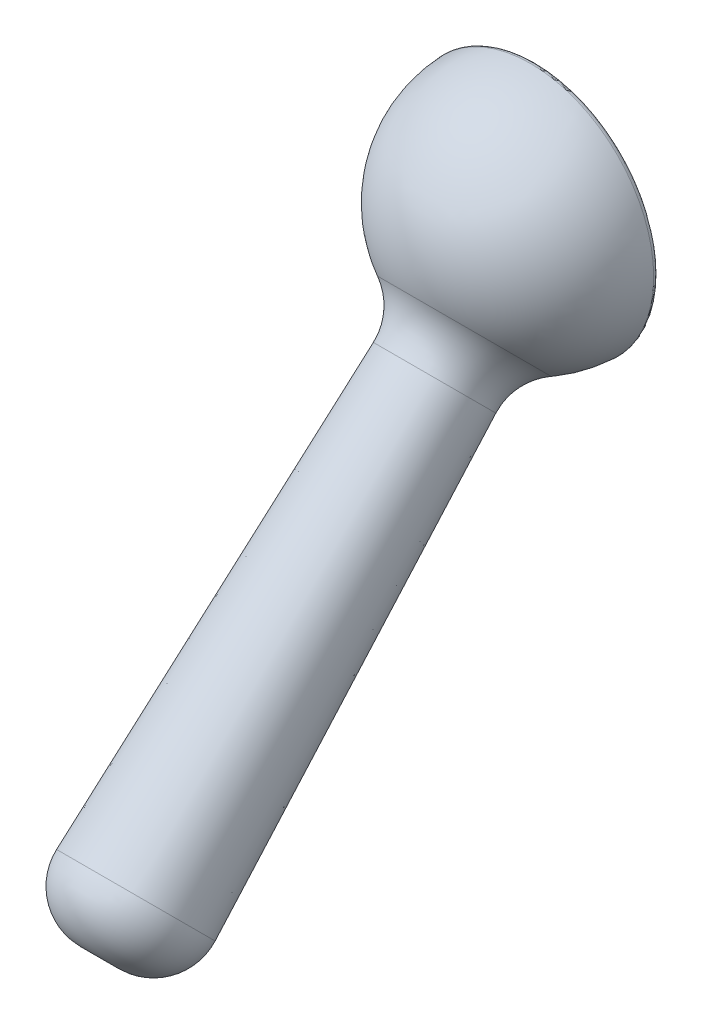
ISO-10303-21;
HEADER;
FILE_DESCRIPTION(('STEP AP214'),'2;1');
FILE_NAME('part.step','',(''),(''),'','','');
FILE_SCHEMA(('AUTOMOTIVE_DESIGN { 1 0 10303 214 1 1 1 1 }'));
ENDSEC;
DATA;
#1=APPLICATION_CONTEXT('core data for automotive mechanical design processes');
#2=APPLICATION_PROTOCOL_DEFINITION('international standard','automotive_design',2000,#1);
#3=PRODUCT_CONTEXT('',#1,'mechanical');
#4=PRODUCT('Part','Part','',(#3));
#5=PRODUCT_RELATED_PRODUCT_CATEGORY('part','',(#4));
#6=PRODUCT_DEFINITION_FORMATION('','',#4);
#7=PRODUCT_DEFINITION_CONTEXT('part definition',#1,'design');
#8=PRODUCT_DEFINITION('design','',#6,#7);
#9=PRODUCT_DEFINITION_SHAPE('','',#8);
#10=(LENGTH_UNIT() NAMED_UNIT(*) SI_UNIT(.MILLI.,.METRE.));
#11=(NAMED_UNIT(*) PLANE_ANGLE_UNIT() SI_UNIT($,.RADIAN.));
#12=(NAMED_UNIT(*) SI_UNIT($,.STERADIAN.) SOLID_ANGLE_UNIT());
#13=UNCERTAINTY_MEASURE_WITH_UNIT(LENGTH_MEASURE(1.E-05),#10,'distance_accuracy_value','');
#14=(GEOMETRIC_REPRESENTATION_CONTEXT(3) GLOBAL_UNCERTAINTY_ASSIGNED_CONTEXT((#13)) GLOBAL_UNIT_ASSIGNED_CONTEXT((#10,
#11,#12)) REPRESENTATION_CONTEXT('',''));
#15=CARTESIAN_POINT('',(0.,0.,0.));
#16=DIRECTION('',(0.,0.,1.));
#17=DIRECTION('',(1.,0.,0.));
#18=AXIS2_PLACEMENT_3D('',#15,#16,#17);
#19=CARTESIAN_POINT('',(0.,0.,0.));
#20=DIRECTION('',(0.,0.,1.));
#21=DIRECTION('',(0.,1.,0.));
#22=AXIS2_PLACEMENT_3D('',#19,#20,#21);
#23=SPHERICAL_SURFACE('',#22,25.);
#24=CARTESIAN_POINT('',(0.,0.,1.04166666666667));
#25=DIRECTION('',(0.,0.,-1.));
#26=DIRECTION('',(-1.,0.,0.));
#27=AXIS2_PLACEMENT_3D('',#24,#25,#26);
#28=CIRCLE('',#27,24.9782891839204);
#29=CARTESIAN_POINT('',(-24.9782891839204,0.,1.04166666666667));
#30=VERTEX_POINT('',#29);
#31=EDGE_CURVE('E48',#30,#30,#28,.F.);
#32=ORIENTED_EDGE('',*,*,#31,.T.);
#33=EDGE_LOOP('',(#32));
#34=FACE_BOUND('',#33,.T.);
#35=CARTESIAN_POINT('',(0.,-14.4602573562772,14.460257356277));
#36=DIRECTION('',(0.,0.707106781186551,-0.707106781186544));
#37=DIRECTION('',(0.,0.707106781186544,0.707106781186551));
#38=AXIS2_PLACEMENT_3D('',#35,#36,#37);
#39=CIRCLE('',#38,14.3806089711274);
#40=CARTESIAN_POINT('',(0.,-4.29163123520093,24.6288834773533));
#41=VERTEX_POINT('',#40);
#42=EDGE_CURVE('E56',#41,#41,#39,.T.);
#43=ORIENTED_EDGE('',*,*,#42,.T.);
#44=EDGE_LOOP('',(#43));
#45=FACE_BOUND('',#44,.T.);
#46=ADVANCED_FACE('F41',(#34,#45),#23,.T.);
#47=CARTESIAN_POINT('',(0.,0.,0.));
#48=DIRECTION('',(0.,0.,1.));
#49=DIRECTION('',(0.,-1.,0.));
#50=AXIS2_PLACEMENT_3D('',#47,#48,#49);
#51=SPHERICAL_SURFACE('',#50,20.);
#52=CARTESIAN_POINT('',(0.,0.,0.));
#53=DIRECTION('',(0.,0.,1.));
#54=DIRECTION('',(1.,0.,0.));
#55=AXIS2_PLACEMENT_3D('',#52,#53,#54);
#56=CIRCLE('',#55,20.);
#57=CARTESIAN_POINT('',(20.,0.,0.));
#58=VERTEX_POINT('',#57);
#59=EDGE_CURVE('E67',#58,#58,#56,.T.);
#60=ORIENTED_EDGE('',*,*,#59,.F.);
#61=EDGE_LOOP('',(#60));
#62=FACE_BOUND('',#61,.T.);
#63=ADVANCED_FACE('F73',(#62),#51,.F.);
#64=CARTESIAN_POINT('',(0.,20.,0.));
#65=DIRECTION('',(0.,0.,1.));
#66=DIRECTION('',(1.,0.,0.));
#67=AXIS2_PLACEMENT_3D('',#64,#65,#66);
#68=PLANE('',#67);
#69=CARTESIAN_POINT('',(0.,0.,0.));
#70=DIRECTION('',(0.,0.,1.));
#71=DIRECTION('',(1.,0.,0.));
#72=AXIS2_PLACEMENT_3D('',#69,#70,#71);
#73=CIRCLE('',#72,23.9791576165636);
#74=CARTESIAN_POINT('',(23.9791576165636,0.,0.));
#75=VERTEX_POINT('',#74);
#76=EDGE_CURVE('E10',#75,#75,#73,.F.);
#77=ORIENTED_EDGE('',*,*,#76,.T.);
#78=EDGE_LOOP('',(#77));
#79=FACE_BOUND('',#78,.T.);
#80=ORIENTED_EDGE('',*,*,#59,.T.);
#81=EDGE_LOOP('',(#80));
#82=FACE_BOUND('',#81,.T.);
#83=ADVANCED_FACE('F71',(#79,#82),#68,.F.);
#84=CARTESIAN_POINT('',(0.,-17.6776695296638,17.6776695296636));
#85=DIRECTION('',(0.,-0.707106781186551,0.707106781186544));
#86=DIRECTION('',(0.,-0.707106781186544,-0.707106781186551));
#87=AXIS2_PLACEMENT_3D('',#84,#85,#86);
#88=CONICAL_SURFACE('',#87,10.,0.0349065850398867);
#89=CARTESIAN_POINT('',(0.,-20.4911370065723,20.4911370065721));
#90=DIRECTION('',(0.,-0.707106781186551,0.707106781186544));
#91=DIRECTION('',(0.,-0.707106781186544,-0.707106781186551));
#92=AXIS2_PLACEMENT_3D('',#89,#90,#91);
#93=CIRCLE('',#92,10.1389442893884);
#94=CARTESIAN_POINT('',(0.,-27.6604532676714,13.321820745473));
#95=VERTEX_POINT('',#94);
#96=EDGE_CURVE('E52',#95,#95,#93,.T.);
#97=ORIENTED_EDGE('',*,*,#96,.T.);
#98=EDGE_LOOP('',(#97));
#99=FACE_BOUND('',#98,.T.);
#100=CARTESIAN_POINT('',(0.,-81.0705031286701,81.0705031286692));
#101=DIRECTION('',(0.,-0.707106781186551,0.707106781186544));
#102=DIRECTION('',(0.,-0.707106781186544,-0.707106781186551));
#103=AXIS2_PLACEMENT_3D('',#100,#101,#102);
#104=CIRCLE('',#103,13.13068208146);
#105=CARTESIAN_POINT('',(0.,-90.3552974700751,71.7857087872641));
#106=VERTEX_POINT('',#105);
#107=EDGE_CURVE('E61',#106,#106,#104,.F.);
#108=ORIENTED_EDGE('',*,*,#107,.T.);
#109=EDGE_LOOP('',(#108));
#110=FACE_BOUND('',#109,.T.);
#111=ADVANCED_FACE('F80',(#99,#110),#88,.T.);
#112=CARTESIAN_POINT('',(0.,-88.3883476483189,88.388347648318));
#113=DIRECTION('',(0.,-0.707106781186551,0.707106781186544));
#114=DIRECTION('',(0.,-0.707106781186544,-0.707106781186551));
#115=AXIS2_PLACEMENT_3D('',#112,#113,#114);
#116=PLANE('',#115);
#117=CARTESIAN_POINT('',(0.,-88.3883476483189,88.388347648318));
#118=DIRECTION('',(0.,-0.707106781186551,0.707106781186544));
#119=DIRECTION('',(0.,-0.707106781186544,-0.707106781186551));
#120=AXIS2_PLACEMENT_3D('',#117,#118,#119);
#121=CIRCLE('',#120,3.13677381126909);
#122=CARTESIAN_POINT('',(0.,-90.6063816813157,86.1703136153212));
#123=VERTEX_POINT('',#122);
#124=EDGE_CURVE('E64',#123,#123,#121,.T.);
#125=ORIENTED_EDGE('',*,*,#124,.T.);
#126=EDGE_LOOP('',(#125));
#127=FACE_BOUND('',#126,.T.);
#128=ADVANCED_FACE('F89',(#127),#116,.T.);
#129=CARTESIAN_POINT('',(0.,-81.3172798364534,81.3172798364525));
#130=DIRECTION('',(0.,-0.707106781186551,0.707106781186544));
#131=DIRECTION('',(0.,-0.707106781186544,-0.707106781186551));
#132=AXIS2_PLACEMENT_3D('',#129,#130,#131);
#133=DEGENERATE_TOROIDAL_SURFACE('',#132,3.13677381126909,10.,.T.);
#134=ORIENTED_EDGE('',*,*,#107,.F.);
#135=EDGE_LOOP('',(#134));
#136=FACE_BOUND('',#135,.T.);
#137=ORIENTED_EDGE('',*,*,#124,.F.);
#138=EDGE_LOOP('',(#137));
#139=FACE_BOUND('',#138,.T.);
#140=ADVANCED_FACE('F86',(#136,#139),#133,.T.);
#141=CARTESIAN_POINT('',(0.,-20.244360298789,20.2443602987888));
#142=DIRECTION('',(0.,0.707106781186551,-0.707106781186544));
#143=DIRECTION('',(0.,0.707106781186544,0.707106781186551));
#144=AXIS2_PLACEMENT_3D('',#141,#142,#143);
#145=TOROIDAL_SURFACE('',#144,20.1328525595793,10.);
#146=ORIENTED_EDGE('',*,*,#96,.F.);
#147=EDGE_LOOP('',(#146));
#148=FACE_BOUND('',#147,.T.);
#149=ORIENTED_EDGE('',*,*,#42,.F.);
#150=EDGE_LOOP('',(#149));
#151=FACE_BOUND('',#150,.T.);
#152=ADVANCED_FACE('F88',(#148,#151),#145,.F.);
#153=CARTESIAN_POINT('',(0.,0.,0.999999999999999));
#154=DIRECTION('',(0.,0.,1.));
#155=DIRECTION('',(1.,0.,0.));
#156=AXIS2_PLACEMENT_3D('',#153,#154,#155);
#157=TOROIDAL_SURFACE('',#156,23.9791576165636,1.);
#158=ORIENTED_EDGE('',*,*,#76,.F.);
#159=EDGE_LOOP('',(#158));
#160=FACE_BOUND('',#159,.T.);
#161=ORIENTED_EDGE('',*,*,#31,.F.);
#162=EDGE_LOOP('',(#161));
#163=FACE_BOUND('',#162,.T.);
#164=ADVANCED_FACE('F43',(#160,#163),#157,.T.);
#165=CLOSED_SHELL('',(#46,#63,#83,#111,#128,#140,#152,#164));
#166=MANIFOLD_SOLID_BREP('B2',#165);
#167=ADVANCED_BREP_SHAPE_REPRESENTATION('',(#18,#166),#14);
#168=SHAPE_DEFINITION_REPRESENTATION(#9,#167);
ENDSEC;
END-ISO-10303-21;
